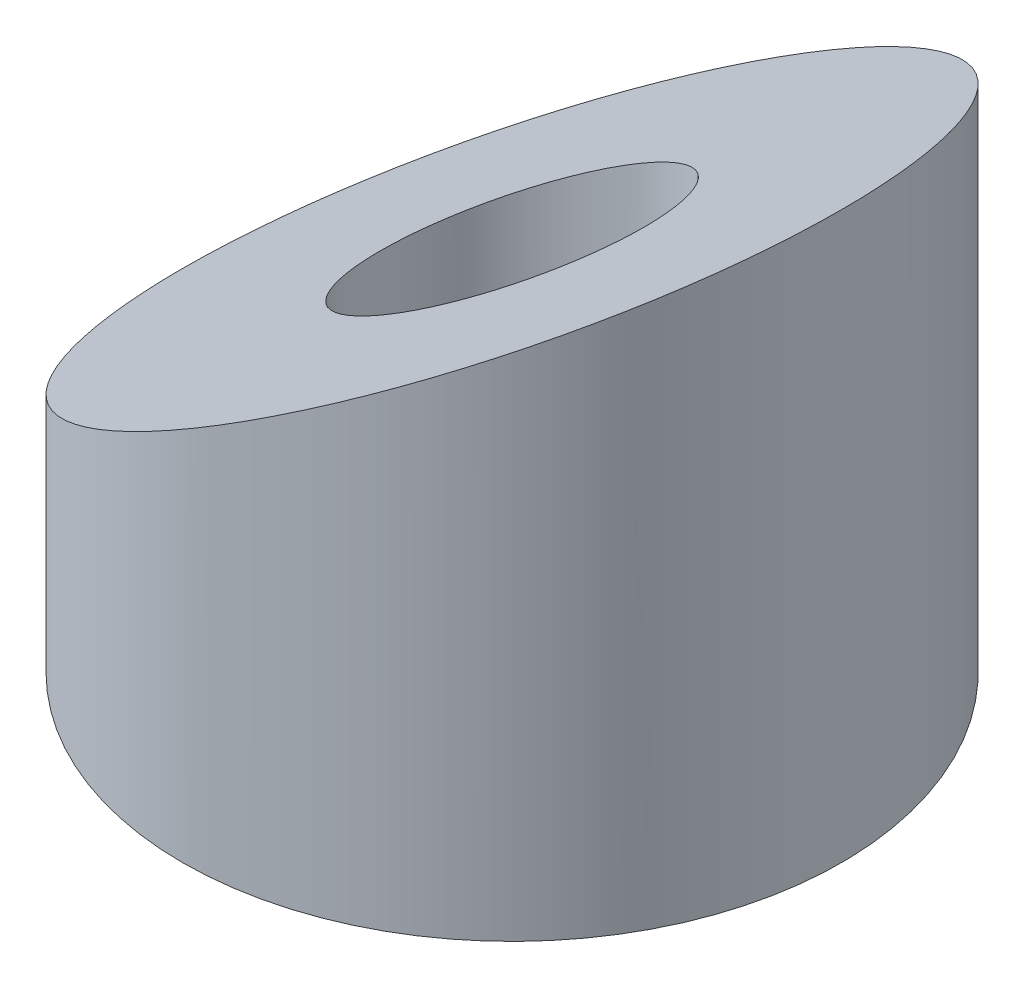
ISO-10303-21;
HEADER;
FILE_DESCRIPTION(('STEP AP214'),'2;1');
FILE_NAME('part.step','',(''),(''),'','','');
FILE_SCHEMA(('AUTOMOTIVE_DESIGN { 1 0 10303 214 1 1 1 1 }'));
ENDSEC;
DATA;
#1=APPLICATION_CONTEXT('core data for automotive mechanical design processes');
#2=APPLICATION_PROTOCOL_DEFINITION('international standard','automotive_design',2000,#1);
#3=PRODUCT_CONTEXT('',#1,'mechanical');
#4=PRODUCT('Part','Part','',(#3));
#5=PRODUCT_RELATED_PRODUCT_CATEGORY('part','',(#4));
#6=PRODUCT_DEFINITION_FORMATION('','',#4);
#7=PRODUCT_DEFINITION_CONTEXT('part definition',#1,'design');
#8=PRODUCT_DEFINITION('design','',#6,#7);
#9=PRODUCT_DEFINITION_SHAPE('','',#8);
#10=(LENGTH_UNIT() NAMED_UNIT(*) SI_UNIT(.MILLI.,.METRE.));
#11=(NAMED_UNIT(*) PLANE_ANGLE_UNIT() SI_UNIT($,.RADIAN.));
#12=(NAMED_UNIT(*) SI_UNIT($,.STERADIAN.) SOLID_ANGLE_UNIT());
#13=UNCERTAINTY_MEASURE_WITH_UNIT(LENGTH_MEASURE(1.E-05),#10,'distance_accuracy_value','');
#14=(GEOMETRIC_REPRESENTATION_CONTEXT(3) GLOBAL_UNCERTAINTY_ASSIGNED_CONTEXT((#13)) GLOBAL_UNIT_ASSIGNED_CONTEXT((#10,
#11,#12)) REPRESENTATION_CONTEXT('',''));
#15=CARTESIAN_POINT('',(0.,0.,0.));
#16=DIRECTION('',(0.,0.,1.));
#17=DIRECTION('',(1.,0.,0.));
#18=AXIS2_PLACEMENT_3D('',#15,#16,#17);
#19=CARTESIAN_POINT('',(0.,4.29,0.));
#20=DIRECTION('',(0.,-1.,0.));
#21=DIRECTION('',(0.,0.,-1.));
#22=AXIS2_PLACEMENT_3D('',#19,#20,#21);
#23=CYLINDRICAL_SURFACE('',#22,2.5);
#24=CARTESIAN_POINT('',(0.,0.,0.));
#25=DIRECTION('',(0.,1.,0.));
#26=DIRECTION('',(0.,0.,1.));
#27=AXIS2_PLACEMENT_3D('',#24,#25,#26);
#28=CIRCLE('',#27,2.5);
#29=CARTESIAN_POINT('',(0.,0.,2.5));
#30=VERTEX_POINT('',#29);
#31=EDGE_CURVE('E10',#30,#30,#28,.T.);
#32=ORIENTED_EDGE('',*,*,#31,.T.);
#33=EDGE_LOOP('',(#32));
#34=FACE_BOUND('',#33,.T.);
#35=CARTESIAN_POINT('',(0.,2.84662432702596,0.));
#36=DIRECTION('',(0.499999999999995,-0.866025403784442,0.));
#37=DIRECTION('',(-0.866025403784442,-0.499999999999995,0.));
#38=AXIS2_PLACEMENT_3D('',#35,#36,#37);
#39=ELLIPSE('',#38,2.88675134594812,2.5);
#40=CARTESIAN_POINT('',(-2.5,1.40324865405191,0.));
#41=VERTEX_POINT('',#40);
#42=EDGE_CURVE('E43',#41,#41,#39,.T.);
#43=ORIENTED_EDGE('',*,*,#42,.T.);
#44=EDGE_LOOP('',(#43));
#45=FACE_BOUND('',#44,.T.);
#46=ADVANCED_FACE('F32',(#34,#45),#23,.T.);
#47=CARTESIAN_POINT('',(0.,0.,0.));
#48=DIRECTION('',(0.,1.,0.));
#49=DIRECTION('',(0.,0.,1.));
#50=AXIS2_PLACEMENT_3D('',#47,#48,#49);
#51=PLANE('',#50);
#52=ORIENTED_EDGE('',*,*,#31,.F.);
#53=EDGE_LOOP('',(#52));
#54=FACE_BOUND('',#53,.T.);
#55=CARTESIAN_POINT('',(0.,0.,0.));
#56=DIRECTION('',(0.,1.,0.));
#57=DIRECTION('',(0.,0.,1.));
#58=AXIS2_PLACEMENT_3D('',#55,#56,#57);
#59=CIRCLE('',#58,1.);
#60=CARTESIAN_POINT('',(0.,0.,1.));
#61=VERTEX_POINT('',#60);
#62=EDGE_CURVE('E39',#61,#61,#59,.T.);
#63=ORIENTED_EDGE('',*,*,#62,.T.);
#64=EDGE_LOOP('',(#63));
#65=FACE_BOUND('',#64,.T.);
#66=ADVANCED_FACE('F58',(#54,#65),#51,.F.);
#67=CARTESIAN_POINT('',(0.,4.29,0.));
#68=DIRECTION('',(0.,-1.,0.));
#69=DIRECTION('',(0.,0.,-1.));
#70=AXIS2_PLACEMENT_3D('',#67,#68,#69);
#71=CYLINDRICAL_SURFACE('',#70,1.);
#72=CARTESIAN_POINT('',(0.,2.84662432702596,0.));
#73=DIRECTION('',(0.499999999999995,-0.866025403784442,0.));
#74=DIRECTION('',(-0.866025403784442,-0.499999999999995,0.));
#75=AXIS2_PLACEMENT_3D('',#72,#73,#74);
#76=ELLIPSE('',#75,1.15470053837925,1.);
#77=CARTESIAN_POINT('',(-1.,2.26927405783634,0.));
#78=VERTEX_POINT('',#77);
#79=EDGE_CURVE('E35',#78,#78,#76,.T.);
#80=ORIENTED_EDGE('',*,*,#79,.F.);
#81=EDGE_LOOP('',(#80));
#82=FACE_BOUND('',#81,.T.);
#83=ORIENTED_EDGE('',*,*,#62,.F.);
#84=EDGE_LOOP('',(#83));
#85=FACE_BOUND('',#84,.T.);
#86=ADVANCED_FACE('F55',(#82,#85),#71,.F.);
#87=CARTESIAN_POINT('',(2.5,4.29,-2.5));
#88=DIRECTION('',(0.499999999999995,-0.866025403784442,0.));
#89=DIRECTION('',(0.866025403784442,0.499999999999995,0.));
#90=AXIS2_PLACEMENT_3D('',#87,#88,#89);
#91=PLANE('',#90);
#92=ORIENTED_EDGE('',*,*,#79,.T.);
#93=EDGE_LOOP('',(#92));
#94=FACE_BOUND('',#93,.T.);
#95=ORIENTED_EDGE('',*,*,#42,.F.);
#96=EDGE_LOOP('',(#95));
#97=FACE_BOUND('',#96,.T.);
#98=ADVANCED_FACE('F52',(#94,#97),#91,.F.);
#99=CLOSED_SHELL('',(#46,#66,#86,#98));
#100=MANIFOLD_SOLID_BREP('B2',#99);
#101=ADVANCED_BREP_SHAPE_REPRESENTATION('',(#18,#100),#14);
#102=SHAPE_DEFINITION_REPRESENTATION(#9,#101);
ENDSEC;
END-ISO-10303-21;
